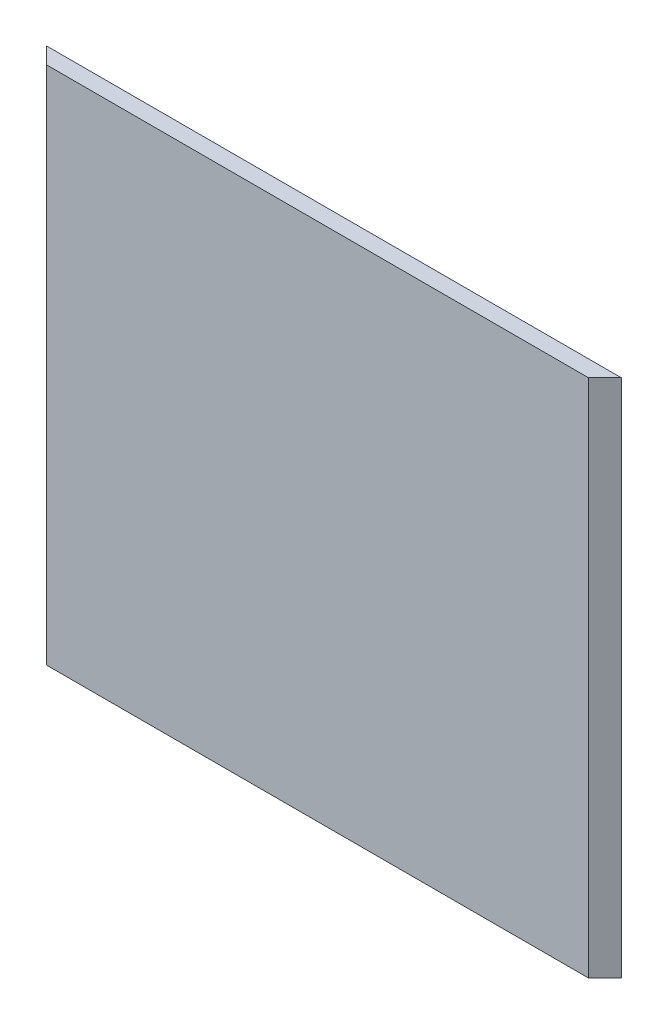
ISO-10303-21;
HEADER;
FILE_DESCRIPTION(('STEP AP214'),'2;1');
FILE_NAME('part.step','',(''),(''),'','','');
FILE_SCHEMA(('AUTOMOTIVE_DESIGN { 1 0 10303 214 1 1 1 1 }'));
ENDSEC;
DATA;
#1=APPLICATION_CONTEXT('core data for automotive mechanical design processes');
#2=APPLICATION_PROTOCOL_DEFINITION('international standard','automotive_design',2000,#1);
#3=PRODUCT_CONTEXT('',#1,'mechanical');
#4=PRODUCT('Part','Part','',(#3));
#5=PRODUCT_RELATED_PRODUCT_CATEGORY('part','',(#4));
#6=PRODUCT_DEFINITION_FORMATION('','',#4);
#7=PRODUCT_DEFINITION_CONTEXT('part definition',#1,'design');
#8=PRODUCT_DEFINITION('design','',#6,#7);
#9=PRODUCT_DEFINITION_SHAPE('','',#8);
#10=(LENGTH_UNIT() NAMED_UNIT(*) SI_UNIT(.MILLI.,.METRE.));
#11=(NAMED_UNIT(*) PLANE_ANGLE_UNIT() SI_UNIT($,.RADIAN.));
#12=(NAMED_UNIT(*) SI_UNIT($,.STERADIAN.) SOLID_ANGLE_UNIT());
#13=UNCERTAINTY_MEASURE_WITH_UNIT(LENGTH_MEASURE(1.E-05),#10,'distance_accuracy_value','');
#14=(GEOMETRIC_REPRESENTATION_CONTEXT(3) GLOBAL_UNCERTAINTY_ASSIGNED_CONTEXT((#13)) GLOBAL_UNIT_ASSIGNED_CONTEXT((#10,
#11,#12)) REPRESENTATION_CONTEXT('',''));
#15=CARTESIAN_POINT('',(0.,0.,0.));
#16=DIRECTION('',(0.,0.,1.));
#17=DIRECTION('',(1.,0.,0.));
#18=AXIS2_PLACEMENT_3D('',#15,#16,#17);
#19=CARTESIAN_POINT('',(0.,95.,1.5));
#20=DIRECTION('',(0.,0.,1.));
#21=DIRECTION('',(1.,0.,0.));
#22=AXIS2_PLACEMENT_3D('',#19,#20,#21);
#23=PLANE('',#22);
#24=DIRECTION('',(-1.,0.,0.));
#25=VECTOR('',#24,1.);
#26=CARTESIAN_POINT('',(0.,0.,1.5));
#27=LINE('',#26,#25);
#28=CARTESIAN_POINT('',(49.5,0.,1.49999999999999));
#29=VERTEX_POINT('',#28);
#30=CARTESIAN_POINT('',(-49.5,0.,1.50000000000001));
#31=VERTEX_POINT('',#30);
#32=EDGE_CURVE('E98',#29,#31,#27,.T.);
#33=ORIENTED_EDGE('',*,*,#32,.F.);
#34=DIRECTION('',(0.,-1.,0.));
#35=VECTOR('',#34,1.);
#36=CARTESIAN_POINT('',(49.5,95.,1.49999999999999));
#37=LINE('',#36,#35);
#38=CARTESIAN_POINT('',(49.5,95.,1.49999999999999));
#39=VERTEX_POINT('',#38);
#40=EDGE_CURVE('E11',#39,#29,#37,.T.);
#41=ORIENTED_EDGE('',*,*,#40,.F.);
#42=DIRECTION('',(-1.,0.,0.));
#43=VECTOR('',#42,1.);
#44=CARTESIAN_POINT('',(0.,95.,1.5));
#45=LINE('',#44,#43);
#46=CARTESIAN_POINT('',(-49.5,95.,1.50000000000001));
#47=VERTEX_POINT('',#46);
#48=EDGE_CURVE('E83',#39,#47,#45,.T.);
#49=ORIENTED_EDGE('',*,*,#48,.T.);
#50=DIRECTION('',(0.,-1.,0.));
#51=VECTOR('',#50,1.);
#52=CARTESIAN_POINT('',(-49.5,95.,1.50000000000001));
#53=LINE('',#52,#51);
#54=EDGE_CURVE('E51',#47,#31,#53,.T.);
#55=ORIENTED_EDGE('',*,*,#54,.T.);
#56=EDGE_LOOP('',(#33,#41,#49,#55));
#57=FACE_BOUND('',#56,.T.);
#58=ADVANCED_FACE('F35',(#57),#23,.T.);
#59=CARTESIAN_POINT('',(25.4999999999997,95.,25.5));
#60=DIRECTION('',(-0.707106781186543,0.,-0.707106781186552));
#61=DIRECTION('',(-0.707106781186552,0.,0.707106781186543));
#62=AXIS2_PLACEMENT_3D('',#59,#60,#61);
#63=PLANE('',#62);
#64=DIRECTION('',(0.707106781186552,0.,-0.707106781186543));
#65=VECTOR('',#64,1.);
#66=CARTESIAN_POINT('',(25.4999999999997,0.,25.5));
#67=LINE('',#66,#65);
#68=CARTESIAN_POINT('',(52.5,0.,-1.50000000000001));
#69=VERTEX_POINT('',#68);
#70=EDGE_CURVE('E89',#29,#69,#67,.T.);
#71=ORIENTED_EDGE('',*,*,#70,.T.);
#72=DIRECTION('',(0.,-1.,0.));
#73=VECTOR('',#72,1.);
#74=CARTESIAN_POINT('',(52.5,95.,-1.50000000000001));
#75=LINE('',#74,#73);
#76=CARTESIAN_POINT('',(52.5,95.,-1.50000000000001));
#77=VERTEX_POINT('',#76);
#78=EDGE_CURVE('E43',#77,#69,#75,.T.);
#79=ORIENTED_EDGE('',*,*,#78,.F.);
#80=DIRECTION('',(0.707106781186552,0.,-0.707106781186543));
#81=VECTOR('',#80,1.);
#82=CARTESIAN_POINT('',(25.4999999999997,95.,25.5));
#83=LINE('',#82,#81);
#84=EDGE_CURVE('E77',#39,#77,#83,.T.);
#85=ORIENTED_EDGE('',*,*,#84,.F.);
#86=ORIENTED_EDGE('',*,*,#40,.T.);
#87=EDGE_LOOP('',(#71,#79,#85,#86));
#88=FACE_BOUND('',#87,.T.);
#89=ADVANCED_FACE('F87',(#88),#63,.F.);
#90=CARTESIAN_POINT('',(0.,95.,-1.5));
#91=DIRECTION('',(0.,0.,1.));
#92=DIRECTION('',(1.,0.,0.));
#93=AXIS2_PLACEMENT_3D('',#90,#91,#92);
#94=PLANE('',#93);
#95=DIRECTION('',(-1.,0.,0.));
#96=VECTOR('',#95,1.);
#97=CARTESIAN_POINT('',(0.,0.,-1.5));
#98=LINE('',#97,#96);
#99=CARTESIAN_POINT('',(-52.5,0.,-1.49999999999999));
#100=VERTEX_POINT('',#99);
#101=EDGE_CURVE('E101',#69,#100,#98,.T.);
#102=ORIENTED_EDGE('',*,*,#101,.T.);
#103=DIRECTION('',(0.,-1.,0.));
#104=VECTOR('',#103,1.);
#105=CARTESIAN_POINT('',(-52.5,95.,-1.49999999999999));
#106=LINE('',#105,#104);
#107=CARTESIAN_POINT('',(-52.5,95.,-1.49999999999999));
#108=VERTEX_POINT('',#107);
#109=EDGE_CURVE('E65',#108,#100,#106,.T.);
#110=ORIENTED_EDGE('',*,*,#109,.F.);
#111=DIRECTION('',(-1.,0.,0.));
#112=VECTOR('',#111,1.);
#113=CARTESIAN_POINT('',(0.,95.,-1.5));
#114=LINE('',#113,#112);
#115=EDGE_CURVE('E82',#77,#108,#114,.T.);
#116=ORIENTED_EDGE('',*,*,#115,.F.);
#117=ORIENTED_EDGE('',*,*,#78,.T.);
#118=EDGE_LOOP('',(#102,#110,#116,#117));
#119=FACE_BOUND('',#118,.T.);
#120=ADVANCED_FACE('F92',(#119),#94,.F.);
#121=CARTESIAN_POINT('',(-25.5,95.,25.5));
#122=DIRECTION('',(-0.707106781186548,0.,0.707106781186547));
#123=DIRECTION('',(0.707106781186547,0.,0.707106781186548));
#124=AXIS2_PLACEMENT_3D('',#121,#122,#123);
#125=PLANE('',#124);
#126=DIRECTION('',(-0.707106781186547,0.,-0.707106781186548));
#127=VECTOR('',#126,1.);
#128=CARTESIAN_POINT('',(-25.5,0.,25.5));
#129=LINE('',#128,#127);
#130=EDGE_CURVE('E103',#31,#100,#129,.T.);
#131=ORIENTED_EDGE('',*,*,#130,.F.);
#132=ORIENTED_EDGE('',*,*,#54,.F.);
#133=DIRECTION('',(-0.707106781186547,0.,-0.707106781186548));
#134=VECTOR('',#133,1.);
#135=CARTESIAN_POINT('',(-25.5,95.,25.5));
#136=LINE('',#135,#134);
#137=EDGE_CURVE('E93',#47,#108,#136,.T.);
#138=ORIENTED_EDGE('',*,*,#137,.T.);
#139=ORIENTED_EDGE('',*,*,#109,.T.);
#140=EDGE_LOOP('',(#131,#132,#138,#139));
#141=FACE_BOUND('',#140,.T.);
#142=ADVANCED_FACE('F108',(#141),#125,.T.);
#143=CARTESIAN_POINT('',(0.,95.,0.));
#144=DIRECTION('',(0.,1.,0.));
#145=DIRECTION('',(0.,0.,1.));
#146=AXIS2_PLACEMENT_3D('',#143,#144,#145);
#147=PLANE('',#146);
#148=ORIENTED_EDGE('',*,*,#48,.F.);
#149=ORIENTED_EDGE('',*,*,#84,.T.);
#150=ORIENTED_EDGE('',*,*,#115,.T.);
#151=ORIENTED_EDGE('',*,*,#137,.F.);
#152=EDGE_LOOP('',(#148,#149,#150,#151));
#153=FACE_BOUND('',#152,.T.);
#154=ADVANCED_FACE('F79',(#153),#147,.T.);
#155=CARTESIAN_POINT('',(0.,0.,0.));
#156=DIRECTION('',(0.,1.,0.));
#157=DIRECTION('',(0.,0.,1.));
#158=AXIS2_PLACEMENT_3D('',#155,#156,#157);
#159=PLANE('',#158);
#160=ORIENTED_EDGE('',*,*,#32,.T.);
#161=ORIENTED_EDGE('',*,*,#130,.T.);
#162=ORIENTED_EDGE('',*,*,#101,.F.);
#163=ORIENTED_EDGE('',*,*,#70,.F.);
#164=EDGE_LOOP('',(#160,#161,#162,#163));
#165=FACE_BOUND('',#164,.T.);
#166=ADVANCED_FACE('F115',(#165),#159,.F.);
#167=CLOSED_SHELL('',(#58,#89,#120,#142,#154,#166));
#168=MANIFOLD_SOLID_BREP('B2',#167);
#169=ADVANCED_BREP_SHAPE_REPRESENTATION('',(#18,#168),#14);
#170=SHAPE_DEFINITION_REPRESENTATION(#9,#169);
ENDSEC;
END-ISO-10303-21;
